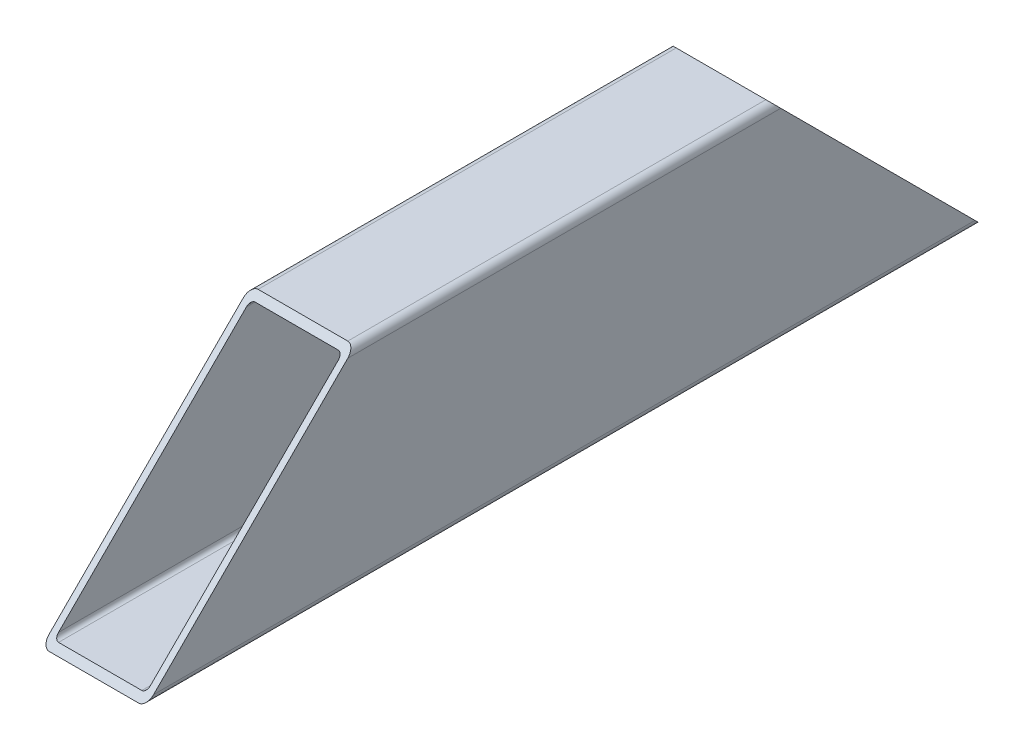
ISO-10303-21;
HEADER;
FILE_DESCRIPTION(('STEP AP214'),'2;1');
FILE_NAME('part.step','',(''),(''),'','','');
FILE_SCHEMA(('AUTOMOTIVE_DESIGN { 1 0 10303 214 1 1 1 1 }'));
ENDSEC;
DATA;
#1=APPLICATION_CONTEXT('core data for automotive mechanical design processes');
#2=APPLICATION_PROTOCOL_DEFINITION('international standard','automotive_design',2000,#1);
#3=PRODUCT_CONTEXT('',#1,'mechanical');
#4=PRODUCT('Part','Part','',(#3));
#5=PRODUCT_RELATED_PRODUCT_CATEGORY('part','',(#4));
#6=PRODUCT_DEFINITION_FORMATION('','',#4);
#7=PRODUCT_DEFINITION_CONTEXT('part definition',#1,'design');
#8=PRODUCT_DEFINITION('design','',#6,#7);
#9=PRODUCT_DEFINITION_SHAPE('','',#8);
#10=(LENGTH_UNIT() NAMED_UNIT(*) SI_UNIT(.MILLI.,.METRE.));
#11=(NAMED_UNIT(*) PLANE_ANGLE_UNIT() SI_UNIT($,.RADIAN.));
#12=(NAMED_UNIT(*) SI_UNIT($,.STERADIAN.) SOLID_ANGLE_UNIT());
#13=UNCERTAINTY_MEASURE_WITH_UNIT(LENGTH_MEASURE(1.E-05),#10,'distance_accuracy_value','');
#14=(GEOMETRIC_REPRESENTATION_CONTEXT(3) GLOBAL_UNCERTAINTY_ASSIGNED_CONTEXT((#13)) GLOBAL_UNIT_ASSIGNED_CONTEXT((#10,
#11,#12)) REPRESENTATION_CONTEXT('',''));
#15=CARTESIAN_POINT('',(0.,0.,0.));
#16=DIRECTION('',(0.,0.,1.));
#17=DIRECTION('',(1.,0.,0.));
#18=AXIS2_PLACEMENT_3D('',#15,#16,#17);
#19=CARTESIAN_POINT('',(10.721,23.221,200.));
#20=DIRECTION('',(0.,0.,-1.));
#21=DIRECTION('',(-1.,0.,0.));
#22=AXIS2_PLACEMENT_3D('',#19,#20,#21);
#23=CYLINDRICAL_SURFACE('',#22,1.779);
#24=DIRECTION('',(0.,0.,-1.));
#25=VECTOR('',#24,1.);
#26=CARTESIAN_POINT('',(12.5,23.221,200.));
#27=LINE('',#26,#25);
#28=CARTESIAN_POINT('',(12.5,23.221,151.779));
#29=VERTEX_POINT('',#28);
#30=CARTESIAN_POINT('',(12.5,23.221,48.2210000000006));
#31=VERTEX_POINT('',#30);
#32=EDGE_CURVE('E150',#29,#31,#27,.T.);
#33=ORIENTED_EDGE('',*,*,#32,.T.);
#34=CARTESIAN_POINT('',(10.721,23.221,48.221));
#35=DIRECTION('',(0.,-0.707106781186551,0.707106781186544));
#36=DIRECTION('',(0.,-0.707106781186544,-0.707106781186552));
#37=AXIS2_PLACEMENT_3D('',#34,#35,#36);
#38=ELLIPSE('',#37,2.51588592746175,1.779);
#39=CARTESIAN_POINT('',(10.721,25.,50.));
#40=VERTEX_POINT('',#39);
#41=EDGE_CURVE('E31',#31,#40,#38,.T.);
#42=ORIENTED_EDGE('',*,*,#41,.T.);
#43=DIRECTION('',(0.,0.,-1.));
#44=VECTOR('',#43,1.);
#45=CARTESIAN_POINT('',(10.721,25.,200.));
#46=LINE('',#45,#44);
#47=CARTESIAN_POINT('',(10.721,25.,150.));
#48=VERTEX_POINT('',#47);
#49=EDGE_CURVE('E169',#48,#40,#46,.T.);
#50=ORIENTED_EDGE('',*,*,#49,.F.);
#51=CARTESIAN_POINT('',(10.721,23.221,151.779));
#52=DIRECTION('',(0.,-0.707106781186546,-0.707106781186549));
#53=DIRECTION('',(0.,0.707106781186549,-0.707106781186546));
#54=AXIS2_PLACEMENT_3D('',#51,#52,#53);
#55=ELLIPSE('',#54,2.51588592746172,1.779);
#56=EDGE_CURVE('E199',#48,#29,#55,.T.);
#57=ORIENTED_EDGE('',*,*,#56,.T.);
#58=EDGE_LOOP('',(#33,#42,#50,#57));
#59=FACE_BOUND('',#58,.T.);
#60=ADVANCED_FACE('F17',(#59),#23,.T.);
#61=CARTESIAN_POINT('',(-10.721,25.,200.));
#62=DIRECTION('',(0.,-1.,0.));
#63=DIRECTION('',(0.,0.,-1.));
#64=AXIS2_PLACEMENT_3D('',#61,#62,#63);
#65=PLANE('',#64);
#66=ORIENTED_EDGE('',*,*,#49,.T.);
#67=DIRECTION('',(-1.,0.,0.));
#68=VECTOR('',#67,1.);
#69=CARTESIAN_POINT('',(-10.721,25.,50.));
#70=LINE('',#69,#68);
#71=CARTESIAN_POINT('',(-10.721,25.,50.));
#72=VERTEX_POINT('',#71);
#73=EDGE_CURVE('E231',#40,#72,#70,.T.);
#74=ORIENTED_EDGE('',*,*,#73,.T.);
#75=DIRECTION('',(0.,0.,-1.));
#76=VECTOR('',#75,1.);
#77=CARTESIAN_POINT('',(-10.721,25.,200.));
#78=LINE('',#77,#76);
#79=CARTESIAN_POINT('',(-10.721,25.,150.));
#80=VERTEX_POINT('',#79);
#81=EDGE_CURVE('E166',#80,#72,#78,.T.);
#82=ORIENTED_EDGE('',*,*,#81,.F.);
#83=DIRECTION('',(1.,0.,0.));
#84=VECTOR('',#83,1.);
#85=CARTESIAN_POINT('',(-10.721,25.,150.));
#86=LINE('',#85,#84);
#87=EDGE_CURVE('E258',#80,#48,#86,.T.);
#88=ORIENTED_EDGE('',*,*,#87,.T.);
#89=EDGE_LOOP('',(#66,#74,#82,#88));
#90=FACE_BOUND('',#89,.T.);
#91=ADVANCED_FACE('F265',(#90),#65,.F.);
#92=CARTESIAN_POINT('',(-10.721,23.221,200.));
#93=DIRECTION('',(0.,0.,-1.));
#94=DIRECTION('',(-1.,0.,0.));
#95=AXIS2_PLACEMENT_3D('',#92,#93,#94);
#96=CYLINDRICAL_SURFACE('',#95,1.779);
#97=ORIENTED_EDGE('',*,*,#81,.T.);
#98=CARTESIAN_POINT('',(-10.721,23.221,48.221));
#99=DIRECTION('',(0.,-0.707106781186551,0.707106781186544));
#100=DIRECTION('',(0.,-0.707106781186544,-0.707106781186552));
#101=AXIS2_PLACEMENT_3D('',#98,#99,#100);
#102=ELLIPSE('',#101,2.51588592746175,1.779);
#103=CARTESIAN_POINT('',(-12.5,23.221,48.221));
#104=VERTEX_POINT('',#103);
#105=EDGE_CURVE('E228',#72,#104,#102,.T.);
#106=ORIENTED_EDGE('',*,*,#105,.T.);
#107=DIRECTION('',(0.,0.,-1.));
#108=VECTOR('',#107,1.);
#109=CARTESIAN_POINT('',(-12.5,23.221,200.));
#110=LINE('',#109,#108);
#111=CARTESIAN_POINT('',(-12.5,23.221,151.779));
#112=VERTEX_POINT('',#111);
#113=EDGE_CURVE('E163',#112,#104,#110,.T.);
#114=ORIENTED_EDGE('',*,*,#113,.F.);
#115=CARTESIAN_POINT('',(-10.721,23.221,151.779));
#116=DIRECTION('',(0.,-0.707106781186546,-0.707106781186549));
#117=DIRECTION('',(0.,0.707106781186549,-0.707106781186546));
#118=AXIS2_PLACEMENT_3D('',#115,#116,#117);
#119=ELLIPSE('',#118,2.51588592746172,1.779);
#120=EDGE_CURVE('E255',#112,#80,#119,.T.);
#121=ORIENTED_EDGE('',*,*,#120,.T.);
#122=EDGE_LOOP('',(#97,#106,#114,#121));
#123=FACE_BOUND('',#122,.T.);
#124=ADVANCED_FACE('F267',(#123),#96,.T.);
#125=CARTESIAN_POINT('',(-12.5,23.221,200.));
#126=DIRECTION('',(1.,0.,0.));
#127=DIRECTION('',(0.,0.,-1.));
#128=AXIS2_PLACEMENT_3D('',#125,#126,#127);
#129=PLANE('',#128);
#130=ORIENTED_EDGE('',*,*,#113,.T.);
#131=DIRECTION('',(0.,-0.707106781186544,-0.707106781186552));
#132=VECTOR('',#131,1.);
#133=CARTESIAN_POINT('',(-12.5,-25.,0.));
#134=LINE('',#133,#132);
#135=CARTESIAN_POINT('',(-12.5,-23.221,1.779));
#136=VERTEX_POINT('',#135);
#137=EDGE_CURVE('E134',#104,#136,#134,.T.);
#138=ORIENTED_EDGE('',*,*,#137,.T.);
#139=DIRECTION('',(0.,0.,-1.));
#140=VECTOR('',#139,1.);
#141=CARTESIAN_POINT('',(-12.5,-23.221,200.));
#142=LINE('',#141,#140);
#143=CARTESIAN_POINT('',(-12.5,-23.221,198.221));
#144=VERTEX_POINT('',#143);
#145=EDGE_CURVE('E160',#144,#136,#142,.T.);
#146=ORIENTED_EDGE('',*,*,#145,.F.);
#147=DIRECTION('',(0.,0.707106781186549,-0.707106781186546));
#148=VECTOR('',#147,1.);
#149=CARTESIAN_POINT('',(-12.5,-25.,200.));
#150=LINE('',#149,#148);
#151=EDGE_CURVE('E192',#144,#112,#150,.T.);
#152=ORIENTED_EDGE('',*,*,#151,.T.);
#153=EDGE_LOOP('',(#130,#138,#146,#152));
#154=FACE_BOUND('',#153,.T.);
#155=ADVANCED_FACE('F270',(#154),#129,.F.);
#156=CARTESIAN_POINT('',(-10.721,-23.221,200.));
#157=DIRECTION('',(0.,0.,-1.));
#158=DIRECTION('',(-1.,0.,0.));
#159=AXIS2_PLACEMENT_3D('',#156,#157,#158);
#160=CYLINDRICAL_SURFACE('',#159,1.779);
#161=ORIENTED_EDGE('',*,*,#145,.T.);
#162=CARTESIAN_POINT('',(-10.721,-23.221,1.779));
#163=DIRECTION('',(0.,-0.707106781186551,0.707106781186544));
#164=DIRECTION('',(0.,-0.707106781186544,-0.707106781186552));
#165=AXIS2_PLACEMENT_3D('',#162,#163,#164);
#166=ELLIPSE('',#165,2.51588592746175,1.779);
#167=CARTESIAN_POINT('',(-10.721,-25.,0.));
#168=VERTEX_POINT('',#167);
#169=EDGE_CURVE('E144',#136,#168,#166,.T.);
#170=ORIENTED_EDGE('',*,*,#169,.T.);
#171=DIRECTION('',(0.,0.,-1.));
#172=VECTOR('',#171,1.);
#173=CARTESIAN_POINT('',(-10.721,-25.,200.));
#174=LINE('',#173,#172);
#175=CARTESIAN_POINT('',(-10.721,-25.,200.));
#176=VERTEX_POINT('',#175);
#177=EDGE_CURVE('E152',#176,#168,#174,.T.);
#178=ORIENTED_EDGE('',*,*,#177,.F.);
#179=CARTESIAN_POINT('',(-10.721,-23.221,198.221));
#180=DIRECTION('',(0.,-0.707106781186546,-0.707106781186549));
#181=DIRECTION('',(0.,0.707106781186549,-0.707106781186546));
#182=AXIS2_PLACEMENT_3D('',#179,#180,#181);
#183=ELLIPSE('',#182,2.51588592746172,1.779);
#184=EDGE_CURVE('E253',#176,#144,#183,.T.);
#185=ORIENTED_EDGE('',*,*,#184,.T.);
#186=EDGE_LOOP('',(#161,#170,#178,#185));
#187=FACE_BOUND('',#186,.T.);
#188=ADVANCED_FACE('F225',(#187),#160,.T.);
#189=CARTESIAN_POINT('',(-10.721,-25.,200.));
#190=DIRECTION('',(0.,1.,0.));
#191=DIRECTION('',(0.,0.,1.));
#192=AXIS2_PLACEMENT_3D('',#189,#190,#191);
#193=PLANE('',#192);
#194=DIRECTION('',(1.,0.,0.));
#195=VECTOR('',#194,1.);
#196=CARTESIAN_POINT('',(-10.721,-25.,0.));
#197=LINE('',#196,#195);
#198=CARTESIAN_POINT('',(10.721,-25.,0.));
#199=VERTEX_POINT('',#198);
#200=EDGE_CURVE('E217',#168,#199,#197,.T.);
#201=ORIENTED_EDGE('',*,*,#200,.T.);
#202=DIRECTION('',(0.,0.,-1.));
#203=VECTOR('',#202,1.);
#204=CARTESIAN_POINT('',(10.721,-25.,200.));
#205=LINE('',#204,#203);
#206=CARTESIAN_POINT('',(10.721,-25.,200.));
#207=VERTEX_POINT('',#206);
#208=EDGE_CURVE('E143',#207,#199,#205,.T.);
#209=ORIENTED_EDGE('',*,*,#208,.F.);
#210=DIRECTION('',(1.,0.,0.));
#211=VECTOR('',#210,1.);
#212=CARTESIAN_POINT('',(-10.721,-25.,200.));
#213=LINE('',#212,#211);
#214=EDGE_CURVE('E154',#176,#207,#213,.T.);
#215=ORIENTED_EDGE('',*,*,#214,.F.);
#216=ORIENTED_EDGE('',*,*,#177,.T.);
#217=EDGE_LOOP('',(#201,#209,#215,#216));
#218=FACE_BOUND('',#217,.T.);
#219=ADVANCED_FACE('F219',(#218),#193,.F.);
#220=CARTESIAN_POINT('',(10.721,-23.221,200.));
#221=DIRECTION('',(0.,0.,-1.));
#222=DIRECTION('',(-1.,0.,0.));
#223=AXIS2_PLACEMENT_3D('',#220,#221,#222);
#224=CYLINDRICAL_SURFACE('',#223,1.779);
#225=ORIENTED_EDGE('',*,*,#208,.T.);
#226=CARTESIAN_POINT('',(10.721,-23.221,1.779));
#227=DIRECTION('',(0.,-0.707106781186551,0.707106781186544));
#228=DIRECTION('',(0.,-0.707106781186544,-0.707106781186552));
#229=AXIS2_PLACEMENT_3D('',#226,#227,#228);
#230=ELLIPSE('',#229,2.51588592746175,1.779);
#231=CARTESIAN_POINT('',(12.5,-23.221,1.779));
#232=VERTEX_POINT('',#231);
#233=EDGE_CURVE('E128',#199,#232,#230,.T.);
#234=ORIENTED_EDGE('',*,*,#233,.T.);
#235=DIRECTION('',(0.,0.,-1.));
#236=VECTOR('',#235,1.);
#237=CARTESIAN_POINT('',(12.5,-23.221,200.));
#238=LINE('',#237,#236);
#239=CARTESIAN_POINT('',(12.5,-23.221,198.221));
#240=VERTEX_POINT('',#239);
#241=EDGE_CURVE('E141',#240,#232,#238,.T.);
#242=ORIENTED_EDGE('',*,*,#241,.F.);
#243=CARTESIAN_POINT('',(10.721,-23.221,198.221));
#244=DIRECTION('',(0.,-0.707106781186546,-0.707106781186549));
#245=DIRECTION('',(0.,0.707106781186549,-0.707106781186546));
#246=AXIS2_PLACEMENT_3D('',#243,#244,#245);
#247=ELLIPSE('',#246,2.51588592746172,1.779);
#248=EDGE_CURVE('E251',#240,#207,#247,.T.);
#249=ORIENTED_EDGE('',*,*,#248,.T.);
#250=EDGE_LOOP('',(#225,#234,#242,#249));
#251=FACE_BOUND('',#250,.T.);
#252=ADVANCED_FACE('F139',(#251),#224,.T.);
#253=CARTESIAN_POINT('',(12.5,23.221,200.));
#254=DIRECTION('',(-1.,0.,0.));
#255=DIRECTION('',(0.,0.,1.));
#256=AXIS2_PLACEMENT_3D('',#253,#254,#255);
#257=PLANE('',#256);
#258=ORIENTED_EDGE('',*,*,#241,.T.);
#259=DIRECTION('',(0.,-0.707106781186544,-0.707106781186552));
#260=VECTOR('',#259,1.);
#261=CARTESIAN_POINT('',(12.5,-25.,0.));
#262=LINE('',#261,#260);
#263=EDGE_CURVE('E125',#31,#232,#262,.T.);
#264=ORIENTED_EDGE('',*,*,#263,.F.);
#265=ORIENTED_EDGE('',*,*,#32,.F.);
#266=DIRECTION('',(0.,0.707106781186549,-0.707106781186546));
#267=VECTOR('',#266,1.);
#268=CARTESIAN_POINT('',(12.5,-25.,200.));
#269=LINE('',#268,#267);
#270=EDGE_CURVE('E149',#240,#29,#269,.T.);
#271=ORIENTED_EDGE('',*,*,#270,.F.);
#272=EDGE_LOOP('',(#258,#264,#265,#271));
#273=FACE_BOUND('',#272,.T.);
#274=ADVANCED_FACE('F148',(#273),#257,.F.);
#275=CARTESIAN_POINT('',(-9.965,22.465,200.));
#276=DIRECTION('',(0.,0.,-1.));
#277=DIRECTION('',(-1.,0.,0.));
#278=AXIS2_PLACEMENT_3D('',#275,#276,#277);
#279=CYLINDRICAL_SURFACE('',#278,1.035);
#280=CARTESIAN_POINT('',(-9.965,22.465,47.465));
#281=DIRECTION('',(0.,-0.707106781186551,0.707106781186544));
#282=DIRECTION('',(0.,-0.707106781186544,-0.707106781186552));
#283=AXIS2_PLACEMENT_3D('',#280,#281,#282);
#284=ELLIPSE('',#283,1.46371103705617,1.035);
#285=CARTESIAN_POINT('',(-9.965,23.5,48.5));
#286=VERTEX_POINT('',#285);
#287=CARTESIAN_POINT('',(-11.,22.465,47.465));
#288=VERTEX_POINT('',#287);
#289=EDGE_CURVE('E145',#286,#288,#284,.T.);
#290=ORIENTED_EDGE('',*,*,#289,.F.);
#291=DIRECTION('',(0.,0.,-1.));
#292=VECTOR('',#291,1.);
#293=CARTESIAN_POINT('',(-9.965,23.5,200.));
#294=LINE('',#293,#292);
#295=CARTESIAN_POINT('',(-9.965,23.5,151.5));
#296=VERTEX_POINT('',#295);
#297=EDGE_CURVE('E195',#296,#286,#294,.T.);
#298=ORIENTED_EDGE('',*,*,#297,.F.);
#299=CARTESIAN_POINT('',(-9.965,22.465,152.535));
#300=DIRECTION('',(0.,-0.707106781186546,-0.707106781186549));
#301=DIRECTION('',(0.,0.707106781186549,-0.707106781186546));
#302=AXIS2_PLACEMENT_3D('',#299,#300,#301);
#303=ELLIPSE('',#302,1.46371103705615,1.035);
#304=CARTESIAN_POINT('',(-11.,22.465,152.535));
#305=VERTEX_POINT('',#304);
#306=EDGE_CURVE('E179',#305,#296,#303,.T.);
#307=ORIENTED_EDGE('',*,*,#306,.F.);
#308=DIRECTION('',(0.,0.,-1.));
#309=VECTOR('',#308,1.);
#310=CARTESIAN_POINT('',(-11.,22.465,200.));
#311=LINE('',#310,#309);
#312=EDGE_CURVE('E214',#305,#288,#311,.T.);
#313=ORIENTED_EDGE('',*,*,#312,.T.);
#314=EDGE_LOOP('',(#290,#298,#307,#313));
#315=FACE_BOUND('',#314,.T.);
#316=ADVANCED_FACE('F292',(#315),#279,.F.);
#317=CARTESIAN_POINT('',(-11.,22.465,200.));
#318=DIRECTION('',(1.,0.,0.));
#319=DIRECTION('',(0.,0.,-1.));
#320=AXIS2_PLACEMENT_3D('',#317,#318,#319);
#321=PLANE('',#320);
#322=DIRECTION('',(0.,-0.707106781186544,-0.707106781186552));
#323=VECTOR('',#322,1.);
#324=CARTESIAN_POINT('',(-11.,98.7325,123.7325));
#325=LINE('',#324,#323);
#326=CARTESIAN_POINT('',(-11.,-22.465,2.53500000000004));
#327=VERTEX_POINT('',#326);
#328=EDGE_CURVE('E282',#288,#327,#325,.T.);
#329=ORIENTED_EDGE('',*,*,#328,.F.);
#330=ORIENTED_EDGE('',*,*,#312,.F.);
#331=DIRECTION('',(0.,0.707106781186549,-0.707106781186546));
#332=VECTOR('',#331,1.);
#333=CARTESIAN_POINT('',(-11.,-1.26749999999991,176.2675));
#334=LINE('',#333,#332);
#335=CARTESIAN_POINT('',(-11.,-22.465,197.465));
#336=VERTEX_POINT('',#335);
#337=EDGE_CURVE('E248',#336,#305,#334,.T.);
#338=ORIENTED_EDGE('',*,*,#337,.F.);
#339=DIRECTION('',(0.,0.,-1.));
#340=VECTOR('',#339,1.);
#341=CARTESIAN_POINT('',(-11.,-22.465,200.));
#342=LINE('',#341,#340);
#343=EDGE_CURVE('E211',#336,#327,#342,.T.);
#344=ORIENTED_EDGE('',*,*,#343,.T.);
#345=EDGE_LOOP('',(#329,#330,#338,#344));
#346=FACE_BOUND('',#345,.T.);
#347=ADVANCED_FACE('F289',(#346),#321,.T.);
#348=CARTESIAN_POINT('',(-9.965,-22.465,200.));
#349=DIRECTION('',(0.,0.,-1.));
#350=DIRECTION('',(-1.,0.,0.));
#351=AXIS2_PLACEMENT_3D('',#348,#349,#350);
#352=CYLINDRICAL_SURFACE('',#351,1.035);
#353=CARTESIAN_POINT('',(-9.965,-22.465,2.53500000000004));
#354=DIRECTION('',(0.,-0.707106781186551,0.707106781186544));
#355=DIRECTION('',(0.,-0.707106781186544,-0.707106781186552));
#356=AXIS2_PLACEMENT_3D('',#353,#354,#355);
#357=ELLIPSE('',#356,1.46371103705617,1.035);
#358=CARTESIAN_POINT('',(-9.965,-23.5,1.50000000000003));
#359=VERTEX_POINT('',#358);
#360=EDGE_CURVE('E280',#327,#359,#357,.T.);
#361=ORIENTED_EDGE('',*,*,#360,.F.);
#362=ORIENTED_EDGE('',*,*,#343,.F.);
#363=CARTESIAN_POINT('',(-9.965,-22.465,197.465));
#364=DIRECTION('',(0.,-0.707106781186546,-0.707106781186549));
#365=DIRECTION('',(0.,0.707106781186549,-0.707106781186546));
#366=AXIS2_PLACEMENT_3D('',#363,#364,#365);
#367=ELLIPSE('',#366,1.46371103705615,1.035);
#368=CARTESIAN_POINT('',(-9.965,-23.5,198.5));
#369=VERTEX_POINT('',#368);
#370=EDGE_CURVE('E246',#369,#336,#367,.T.);
#371=ORIENTED_EDGE('',*,*,#370,.F.);
#372=DIRECTION('',(0.,0.,-1.));
#373=VECTOR('',#372,1.);
#374=CARTESIAN_POINT('',(-9.965,-23.5,200.));
#375=LINE('',#374,#373);
#376=EDGE_CURVE('E208',#369,#359,#375,.T.);
#377=ORIENTED_EDGE('',*,*,#376,.T.);
#378=EDGE_LOOP('',(#361,#362,#371,#377));
#379=FACE_BOUND('',#378,.T.);
#380=ADVANCED_FACE('F301',(#379),#352,.F.);
#381=CARTESIAN_POINT('',(-9.965,-23.5,200.));
#382=DIRECTION('',(0.,1.,0.));
#383=DIRECTION('',(0.,0.,1.));
#384=AXIS2_PLACEMENT_3D('',#381,#382,#383);
#385=PLANE('',#384);
#386=DIRECTION('',(1.,0.,0.));
#387=VECTOR('',#386,1.);
#388=CARTESIAN_POINT('',(-9.965,-23.5,1.50000000000003));
#389=LINE('',#388,#387);
#390=CARTESIAN_POINT('',(9.965,-23.5,1.50000000000003));
#391=VERTEX_POINT('',#390);
#392=EDGE_CURVE('E278',#359,#391,#389,.T.);
#393=ORIENTED_EDGE('',*,*,#392,.F.);
#394=ORIENTED_EDGE('',*,*,#376,.F.);
#395=DIRECTION('',(-1.,0.,0.));
#396=VECTOR('',#395,1.);
#397=CARTESIAN_POINT('',(-9.965,-23.5,198.5));
#398=LINE('',#397,#396);
#399=CARTESIAN_POINT('',(9.965,-23.5,198.5));
#400=VERTEX_POINT('',#399);
#401=EDGE_CURVE('E244',#400,#369,#398,.T.);
#402=ORIENTED_EDGE('',*,*,#401,.F.);
#403=DIRECTION('',(0.,0.,-1.));
#404=VECTOR('',#403,1.);
#405=CARTESIAN_POINT('',(9.965,-23.5,200.));
#406=LINE('',#405,#404);
#407=EDGE_CURVE('E205',#400,#391,#406,.T.);
#408=ORIENTED_EDGE('',*,*,#407,.T.);
#409=EDGE_LOOP('',(#393,#394,#402,#408));
#410=FACE_BOUND('',#409,.T.);
#411=ADVANCED_FACE('F356',(#410),#385,.T.);
#412=CARTESIAN_POINT('',(9.965,-22.465,200.));
#413=DIRECTION('',(0.,0.,-1.));
#414=DIRECTION('',(-1.,0.,0.));
#415=AXIS2_PLACEMENT_3D('',#412,#413,#414);
#416=CYLINDRICAL_SURFACE('',#415,1.035);
#417=CARTESIAN_POINT('',(9.965,-22.465,2.53500000000004));
#418=DIRECTION('',(0.,-0.707106781186551,0.707106781186544));
#419=DIRECTION('',(0.,-0.707106781186544,-0.707106781186552));
#420=AXIS2_PLACEMENT_3D('',#417,#418,#419);
#421=ELLIPSE('',#420,1.46371103705617,1.035);
#422=CARTESIAN_POINT('',(11.,-22.465,2.535));
#423=VERTEX_POINT('',#422);
#424=EDGE_CURVE('E276',#391,#423,#421,.T.);
#425=ORIENTED_EDGE('',*,*,#424,.F.);
#426=ORIENTED_EDGE('',*,*,#407,.F.);
#427=CARTESIAN_POINT('',(9.965,-22.465,197.465));
#428=DIRECTION('',(0.,-0.707106781186546,-0.707106781186549));
#429=DIRECTION('',(0.,0.707106781186549,-0.707106781186546));
#430=AXIS2_PLACEMENT_3D('',#427,#428,#429);
#431=ELLIPSE('',#430,1.46371103705615,1.035);
#432=CARTESIAN_POINT('',(11.,-22.465,197.465));
#433=VERTEX_POINT('',#432);
#434=EDGE_CURVE('E242',#433,#400,#431,.T.);
#435=ORIENTED_EDGE('',*,*,#434,.F.);
#436=DIRECTION('',(0.,0.,-1.));
#437=VECTOR('',#436,1.);
#438=CARTESIAN_POINT('',(11.,-22.465,200.));
#439=LINE('',#438,#437);
#440=EDGE_CURVE('E197',#433,#423,#439,.T.);
#441=ORIENTED_EDGE('',*,*,#440,.T.);
#442=EDGE_LOOP('',(#425,#426,#435,#441));
#443=FACE_BOUND('',#442,.T.);
#444=ADVANCED_FACE('F366',(#443),#416,.F.);
#445=CARTESIAN_POINT('',(11.,22.465,200.));
#446=DIRECTION('',(-1.,0.,0.));
#447=DIRECTION('',(0.,0.,1.));
#448=AXIS2_PLACEMENT_3D('',#445,#446,#447);
#449=PLANE('',#448);
#450=DIRECTION('',(0.,0.707106781186544,0.707106781186552));
#451=VECTOR('',#450,1.);
#452=CARTESIAN_POINT('',(11.,98.7325,123.7325));
#453=LINE('',#452,#451);
#454=CARTESIAN_POINT('',(11.,22.465,47.465));
#455=VERTEX_POINT('',#454);
#456=EDGE_CURVE('E272',#423,#455,#453,.T.);
#457=ORIENTED_EDGE('',*,*,#456,.F.);
#458=ORIENTED_EDGE('',*,*,#440,.F.);
#459=DIRECTION('',(0.,-0.707106781186549,0.707106781186546));
#460=VECTOR('',#459,1.);
#461=CARTESIAN_POINT('',(11.,-1.26749999999991,176.2675));
#462=LINE('',#461,#460);
#463=CARTESIAN_POINT('',(11.,22.465,152.535));
#464=VERTEX_POINT('',#463);
#465=EDGE_CURVE('E191',#464,#433,#462,.T.);
#466=ORIENTED_EDGE('',*,*,#465,.F.);
#467=DIRECTION('',(0.,0.,-1.));
#468=VECTOR('',#467,1.);
#469=CARTESIAN_POINT('',(11.,22.465,200.));
#470=LINE('',#469,#468);
#471=EDGE_CURVE('E190',#464,#455,#470,.T.);
#472=ORIENTED_EDGE('',*,*,#471,.T.);
#473=EDGE_LOOP('',(#457,#458,#466,#472));
#474=FACE_BOUND('',#473,.T.);
#475=ADVANCED_FACE('F376',(#474),#449,.T.);
#476=CARTESIAN_POINT('',(9.965,22.465,200.));
#477=DIRECTION('',(0.,0.,-1.));
#478=DIRECTION('',(-1.,0.,0.));
#479=AXIS2_PLACEMENT_3D('',#476,#477,#478);
#480=CYLINDRICAL_SURFACE('',#479,1.035);
#481=CARTESIAN_POINT('',(9.965,22.465,47.465));
#482=DIRECTION('',(0.,-0.707106781186551,0.707106781186544));
#483=DIRECTION('',(0.,-0.707106781186544,-0.707106781186552));
#484=AXIS2_PLACEMENT_3D('',#481,#482,#483);
#485=ELLIPSE('',#484,1.46371103705617,1.035);
#486=CARTESIAN_POINT('',(9.965,23.5,48.5));
#487=VERTEX_POINT('',#486);
#488=EDGE_CURVE('E38',#455,#487,#485,.T.);
#489=ORIENTED_EDGE('',*,*,#488,.F.);
#490=ORIENTED_EDGE('',*,*,#471,.F.);
#491=CARTESIAN_POINT('',(9.965,22.465,152.535));
#492=DIRECTION('',(0.,-0.707106781186546,-0.707106781186549));
#493=DIRECTION('',(0.,0.707106781186549,-0.707106781186546));
#494=AXIS2_PLACEMENT_3D('',#491,#492,#493);
#495=ELLIPSE('',#494,1.46371103705615,1.035);
#496=CARTESIAN_POINT('',(9.965,23.5,151.5));
#497=VERTEX_POINT('',#496);
#498=EDGE_CURVE('E176',#497,#464,#495,.T.);
#499=ORIENTED_EDGE('',*,*,#498,.F.);
#500=DIRECTION('',(0.,0.,-1.));
#501=VECTOR('',#500,1.);
#502=CARTESIAN_POINT('',(9.965,23.5,200.));
#503=LINE('',#502,#501);
#504=EDGE_CURVE('E188',#497,#487,#503,.T.);
#505=ORIENTED_EDGE('',*,*,#504,.T.);
#506=EDGE_LOOP('',(#489,#490,#499,#505));
#507=FACE_BOUND('',#506,.T.);
#508=ADVANCED_FACE('F187',(#507),#480,.F.);
#509=CARTESIAN_POINT('',(-9.965,23.5,200.));
#510=DIRECTION('',(0.,-1.,0.));
#511=DIRECTION('',(0.,0.,-1.));
#512=AXIS2_PLACEMENT_3D('',#509,#510,#511);
#513=PLANE('',#512);
#514=DIRECTION('',(-1.,0.,0.));
#515=VECTOR('',#514,1.);
#516=CARTESIAN_POINT('',(-9.965,23.5,48.5));
#517=LINE('',#516,#515);
#518=EDGE_CURVE('E11',#487,#286,#517,.T.);
#519=ORIENTED_EDGE('',*,*,#518,.F.);
#520=ORIENTED_EDGE('',*,*,#504,.F.);
#521=DIRECTION('',(1.,0.,0.));
#522=VECTOR('',#521,1.);
#523=CARTESIAN_POINT('',(-9.965,23.5,151.5));
#524=LINE('',#523,#522);
#525=EDGE_CURVE('E24',#296,#497,#524,.T.);
#526=ORIENTED_EDGE('',*,*,#525,.F.);
#527=ORIENTED_EDGE('',*,*,#297,.T.);
#528=EDGE_LOOP('',(#519,#520,#526,#527));
#529=FACE_BOUND('',#528,.T.);
#530=ADVANCED_FACE('F194',(#529),#513,.T.);
#531=CARTESIAN_POINT('',(-12.5,-25.,200.));
#532=DIRECTION('',(0.,-0.707106781186546,-0.707106781186549));
#533=DIRECTION('',(0.,0.707106781186549,-0.707106781186546));
#534=AXIS2_PLACEMENT_3D('',#531,#532,#533);
#535=PLANE('',#534);
#536=ORIENTED_EDGE('',*,*,#306,.T.);
#537=ORIENTED_EDGE('',*,*,#525,.T.);
#538=ORIENTED_EDGE('',*,*,#498,.T.);
#539=ORIENTED_EDGE('',*,*,#465,.T.);
#540=ORIENTED_EDGE('',*,*,#434,.T.);
#541=ORIENTED_EDGE('',*,*,#401,.T.);
#542=ORIENTED_EDGE('',*,*,#370,.T.);
#543=ORIENTED_EDGE('',*,*,#337,.T.);
#544=EDGE_LOOP('',(#536,#537,#538,#539,#540,#541,#542,#543));
#545=FACE_BOUND('',#544,.T.);
#546=ORIENTED_EDGE('',*,*,#87,.F.);
#547=ORIENTED_EDGE('',*,*,#120,.F.);
#548=ORIENTED_EDGE('',*,*,#151,.F.);
#549=ORIENTED_EDGE('',*,*,#184,.F.);
#550=ORIENTED_EDGE('',*,*,#214,.T.);
#551=ORIENTED_EDGE('',*,*,#248,.F.);
#552=ORIENTED_EDGE('',*,*,#270,.T.);
#553=ORIENTED_EDGE('',*,*,#56,.F.);
#554=EDGE_LOOP('',(#546,#547,#548,#549,#550,#551,#552,#553));
#555=FACE_BOUND('',#554,.T.);
#556=ADVANCED_FACE('F174',(#545,#555),#535,.F.);
#557=CARTESIAN_POINT('',(-12.5,-25.,0.));
#558=DIRECTION('',(0.,-0.707106781186551,0.707106781186544));
#559=DIRECTION('',(0.,-0.707106781186544,-0.707106781186552));
#560=AXIS2_PLACEMENT_3D('',#557,#558,#559);
#561=PLANE('',#560);
#562=ORIENTED_EDGE('',*,*,#289,.T.);
#563=ORIENTED_EDGE('',*,*,#328,.T.);
#564=ORIENTED_EDGE('',*,*,#360,.T.);
#565=ORIENTED_EDGE('',*,*,#392,.T.);
#566=ORIENTED_EDGE('',*,*,#424,.T.);
#567=ORIENTED_EDGE('',*,*,#456,.T.);
#568=ORIENTED_EDGE('',*,*,#488,.T.);
#569=ORIENTED_EDGE('',*,*,#518,.T.);
#570=EDGE_LOOP('',(#562,#563,#564,#565,#566,#567,#568,#569));
#571=FACE_BOUND('',#570,.T.);
#572=ORIENTED_EDGE('',*,*,#263,.T.);
#573=ORIENTED_EDGE('',*,*,#233,.F.);
#574=ORIENTED_EDGE('',*,*,#200,.F.);
#575=ORIENTED_EDGE('',*,*,#169,.F.);
#576=ORIENTED_EDGE('',*,*,#137,.F.);
#577=ORIENTED_EDGE('',*,*,#105,.F.);
#578=ORIENTED_EDGE('',*,*,#73,.F.);
#579=ORIENTED_EDGE('',*,*,#41,.F.);
#580=EDGE_LOOP('',(#572,#573,#574,#575,#576,#577,#578,#579));
#581=FACE_BOUND('',#580,.T.);
#582=ADVANCED_FACE('F127',(#571,#581),#561,.F.);
#583=CLOSED_SHELL('',(#60,#91,#124,#155,#188,#219,#252,#274,#316,#347,#380,#411,#444,#475,#508,
#530,#556,#582));
#584=MANIFOLD_SOLID_BREP('B1',#583);
#585=ADVANCED_BREP_SHAPE_REPRESENTATION('',(#18,#584),#14);
#586=SHAPE_DEFINITION_REPRESENTATION(#9,#585);
ENDSEC;
END-ISO-10303-21;
